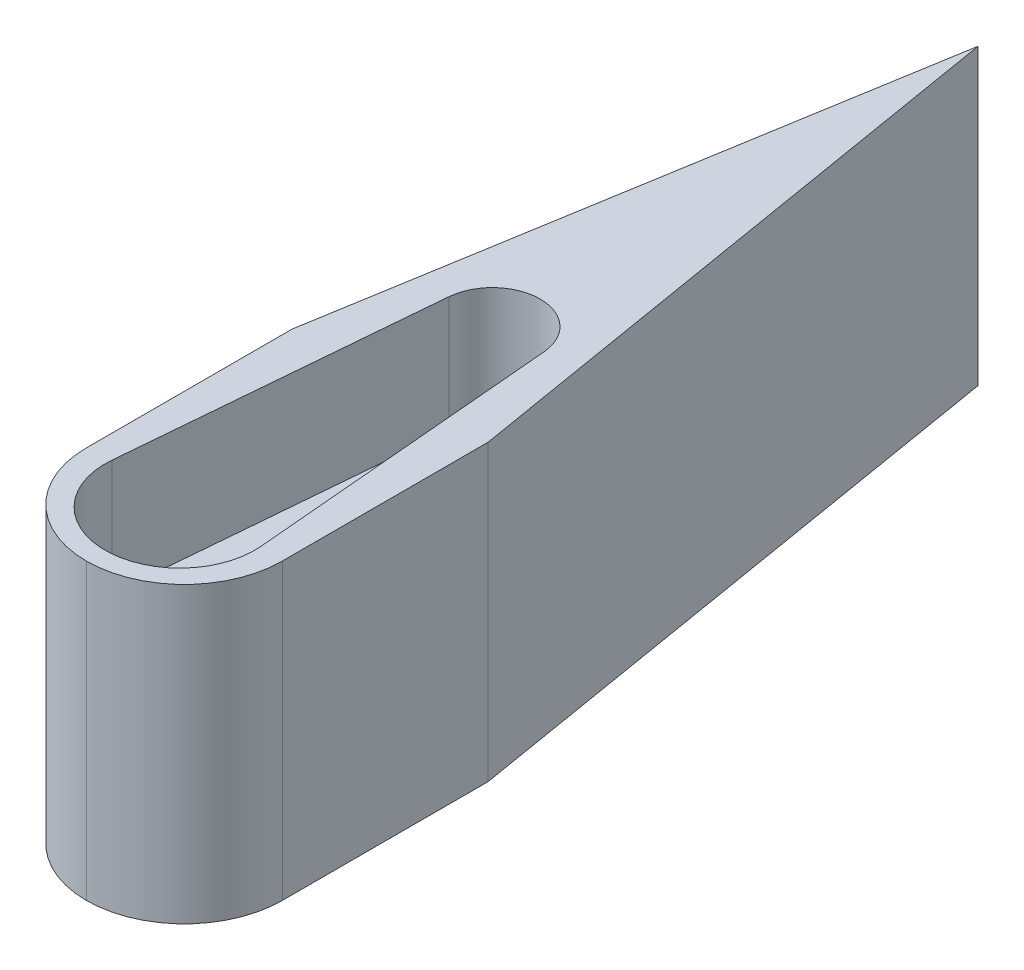
ISO-10303-21;
HEADER;
FILE_DESCRIPTION(('STEP AP214'),'2;1');
FILE_NAME('part.step','',(''),(''),'','','');
FILE_SCHEMA(('AUTOMOTIVE_DESIGN { 1 0 10303 214 1 1 1 1 }'));
ENDSEC;
DATA;
#1=APPLICATION_CONTEXT('core data for automotive mechanical design processes');
#2=APPLICATION_PROTOCOL_DEFINITION('international standard','automotive_design',2000,#1);
#3=PRODUCT_CONTEXT('',#1,'mechanical');
#4=PRODUCT('Part','Part','',(#3));
#5=PRODUCT_RELATED_PRODUCT_CATEGORY('part','',(#4));
#6=PRODUCT_DEFINITION_FORMATION('','',#4);
#7=PRODUCT_DEFINITION_CONTEXT('part definition',#1,'design');
#8=PRODUCT_DEFINITION('design','',#6,#7);
#9=PRODUCT_DEFINITION_SHAPE('','',#8);
#10=(LENGTH_UNIT() NAMED_UNIT(*) SI_UNIT(.MILLI.,.METRE.));
#11=(NAMED_UNIT(*) PLANE_ANGLE_UNIT() SI_UNIT($,.RADIAN.));
#12=(NAMED_UNIT(*) SI_UNIT($,.STERADIAN.) SOLID_ANGLE_UNIT());
#13=UNCERTAINTY_MEASURE_WITH_UNIT(LENGTH_MEASURE(1.E-05),#10,'distance_accuracy_value','');
#14=(GEOMETRIC_REPRESENTATION_CONTEXT(3) GLOBAL_UNCERTAINTY_ASSIGNED_CONTEXT((#13)) GLOBAL_UNIT_ASSIGNED_CONTEXT((#10,
#11,#12)) REPRESENTATION_CONTEXT('',''));
#15=CARTESIAN_POINT('',(0.,0.,0.));
#16=DIRECTION('',(0.,0.,1.));
#17=DIRECTION('',(1.,0.,0.));
#18=AXIS2_PLACEMENT_3D('',#15,#16,#17);
#19=CARTESIAN_POINT('',(0.,19.05,0.));
#20=DIRECTION('',(0.,1.,0.));
#21=DIRECTION('',(0.,0.,1.));
#22=AXIS2_PLACEMENT_3D('',#19,#20,#21);
#23=PLANE('',#22);
#24=DIRECTION('',(0.,0.,1.));
#25=VECTOR('',#24,1.);
#26=CARTESIAN_POINT('',(-6.35,19.05,0.));
#27=LINE('',#26,#25);
#28=CARTESIAN_POINT('',(-6.35,19.05,0.));
#29=VERTEX_POINT('',#28);
#30=CARTESIAN_POINT('',(-6.35,19.05,13.335));
#31=VERTEX_POINT('',#30);
#32=EDGE_CURVE('E150',#29,#31,#27,.T.);
#33=ORIENTED_EDGE('',*,*,#32,.T.);
#34=CARTESIAN_POINT('',(0.,19.05,13.335));
#35=DIRECTION('',(0.,1.,0.));
#36=DIRECTION('',(0.,0.,1.));
#37=AXIS2_PLACEMENT_3D('',#34,#35,#36);
#38=CIRCLE('',#37,6.35);
#39=CARTESIAN_POINT('',(0.,19.05,19.685));
#40=VERTEX_POINT('',#39);
#41=EDGE_CURVE('E48',#31,#40,#38,.T.);
#42=ORIENTED_EDGE('',*,*,#41,.T.);
#43=CARTESIAN_POINT('',(0.,19.05,13.335));
#44=DIRECTION('',(0.,1.,0.));
#45=DIRECTION('',(0.,0.,1.));
#46=AXIS2_PLACEMENT_3D('',#43,#44,#45);
#47=CIRCLE('',#46,6.35);
#48=CARTESIAN_POINT('',(6.35,19.05,13.335));
#49=VERTEX_POINT('',#48);
#50=EDGE_CURVE('E63',#40,#49,#47,.T.);
#51=ORIENTED_EDGE('',*,*,#50,.T.);
#52=DIRECTION('',(0.,0.,-1.));
#53=VECTOR('',#52,1.);
#54=CARTESIAN_POINT('',(6.35,19.05,0.));
#55=LINE('',#54,#53);
#56=CARTESIAN_POINT('',(6.35,19.05,0.));
#57=VERTEX_POINT('',#56);
#58=EDGE_CURVE('E153',#49,#57,#55,.T.);
#59=ORIENTED_EDGE('',*,*,#58,.T.);
#60=DIRECTION('',(-0.164398987305357,0.,-0.986393923832144));
#61=VECTOR('',#60,1.);
#62=CARTESIAN_POINT('',(0.,19.05,-38.1));
#63=LINE('',#62,#61);
#64=CARTESIAN_POINT('',(0.,19.05,-38.1));
#65=VERTEX_POINT('',#64);
#66=EDGE_CURVE('E144',#57,#65,#63,.T.);
#67=ORIENTED_EDGE('',*,*,#66,.T.);
#68=DIRECTION('',(-0.164398987305357,0.,0.986393923832144));
#69=VECTOR('',#68,1.);
#70=CARTESIAN_POINT('',(0.,19.05,-38.1));
#71=LINE('',#70,#69);
#72=EDGE_CURVE('E147',#65,#29,#71,.T.);
#73=ORIENTED_EDGE('',*,*,#72,.T.);
#74=EDGE_LOOP('',(#33,#42,#51,#59,#67,#73));
#75=FACE_BOUND('',#74,.T.);
#76=DIRECTION('',(0.08641975308642,0.,0.996258814905285));
#77=VECTOR('',#76,1.);
#78=CARTESIAN_POINT('',(3.08840232620704,19.05,-6.89625090927795));
#79=LINE('',#78,#77);
#80=CARTESIAN_POINT('',(3.08840232620704,19.05,-6.89625090927795));
#81=VERTEX_POINT('',#80);
#82=CARTESIAN_POINT('',(4.8318552522913,19.05,13.2025145228208));
#83=VERTEX_POINT('',#82);
#84=EDGE_CURVE('E131',#81,#83,#79,.T.);
#85=ORIENTED_EDGE('',*,*,#84,.T.);
#86=CARTESIAN_POINT('',(6.66567495644088E-13,19.05,13.62165032529));
#87=DIRECTION('',(0.,-1.,0.));
#88=DIRECTION('',(0.,0.,-1.));
#89=AXIS2_PLACEMENT_3D('',#86,#87,#88);
#90=CIRCLE('',#89,4.85);
#91=CARTESIAN_POINT('',(-4.83185525228996,19.05,13.2025145228208));
#92=VERTEX_POINT('',#91);
#93=EDGE_CURVE('E55',#83,#92,#90,.T.);
#94=ORIENTED_EDGE('',*,*,#93,.T.);
#95=DIRECTION('',(0.0864197530864198,0.,-0.996258814905285));
#96=VECTOR('',#95,1.);
#97=CARTESIAN_POINT('',(-4.83185525228996,19.05,13.2025145228208));
#98=LINE('',#97,#96);
#99=CARTESIAN_POINT('',(-3.08840232620572,19.05,-6.89625090927795));
#100=VERTEX_POINT('',#99);
#101=EDGE_CURVE('E135',#92,#100,#98,.T.);
#102=ORIENTED_EDGE('',*,*,#101,.T.);
#103=CARTESIAN_POINT('',(6.6418225086462E-13,19.05,-6.62834967471006));
#104=DIRECTION('',(0.,-1.,0.));
#105=DIRECTION('',(0.,0.,-1.));
#106=AXIS2_PLACEMENT_3D('',#103,#104,#105);
#107=CIRCLE('',#106,3.1);
#108=EDGE_CURVE('E317',#100,#81,#107,.T.);
#109=ORIENTED_EDGE('',*,*,#108,.T.);
#110=EDGE_LOOP('',(#85,#94,#102,#109));
#111=FACE_BOUND('',#110,.T.);
#112=ADVANCED_FACE('F39',(#75,#111),#23,.T.);
#113=CARTESIAN_POINT('',(0.,19.05,-38.1));
#114=DIRECTION('',(-0.986393923832144,0.,0.164398987305357));
#115=DIRECTION('',(0.164398987305357,0.,0.986393923832144));
#116=AXIS2_PLACEMENT_3D('',#113,#114,#115);
#117=PLANE('',#116);
#118=DIRECTION('',(-0.164398987305357,0.,-0.986393923832144));
#119=VECTOR('',#118,1.);
#120=CARTESIAN_POINT('',(0.,0.,-38.1));
#121=LINE('',#120,#119);
#122=CARTESIAN_POINT('',(6.35,0.,0.));
#123=VERTEX_POINT('',#122);
#124=CARTESIAN_POINT('',(0.,0.,-38.1));
#125=VERTEX_POINT('',#124);
#126=EDGE_CURVE('E139',#123,#125,#121,.T.);
#127=ORIENTED_EDGE('',*,*,#126,.T.);
#128=DIRECTION('',(0.,-1.,0.));
#129=VECTOR('',#128,1.);
#130=CARTESIAN_POINT('',(0.,19.05,-38.1));
#131=LINE('',#130,#129);
#132=EDGE_CURVE('E169',#65,#125,#131,.T.);
#133=ORIENTED_EDGE('',*,*,#132,.F.);
#134=ORIENTED_EDGE('',*,*,#66,.F.);
#135=DIRECTION('',(0.,-1.,0.));
#136=VECTOR('',#135,1.);
#137=CARTESIAN_POINT('',(6.35,19.05,0.));
#138=LINE('',#137,#136);
#139=EDGE_CURVE('E155',#57,#123,#138,.T.);
#140=ORIENTED_EDGE('',*,*,#139,.T.);
#141=EDGE_LOOP('',(#127,#133,#134,#140));
#142=FACE_BOUND('',#141,.T.);
#143=ADVANCED_FACE('F202',(#142),#117,.F.);
#144=CARTESIAN_POINT('',(0.,19.05,-38.1));
#145=DIRECTION('',(0.986393923832144,0.,0.164398987305357));
#146=DIRECTION('',(0.164398987305357,0.,-0.986393923832144));
#147=AXIS2_PLACEMENT_3D('',#144,#145,#146);
#148=PLANE('',#147);
#149=DIRECTION('',(-0.164398987305357,0.,0.986393923832144));
#150=VECTOR('',#149,1.);
#151=CARTESIAN_POINT('',(0.,0.,-38.1));
#152=LINE('',#151,#150);
#153=CARTESIAN_POINT('',(-6.35,0.,0.));
#154=VERTEX_POINT('',#153);
#155=EDGE_CURVE('E158',#125,#154,#152,.T.);
#156=ORIENTED_EDGE('',*,*,#155,.T.);
#157=DIRECTION('',(0.,-1.,0.));
#158=VECTOR('',#157,1.);
#159=CARTESIAN_POINT('',(-6.35,19.05,0.));
#160=LINE('',#159,#158);
#161=EDGE_CURVE('E166',#29,#154,#160,.T.);
#162=ORIENTED_EDGE('',*,*,#161,.F.);
#163=ORIENTED_EDGE('',*,*,#72,.F.);
#164=ORIENTED_EDGE('',*,*,#132,.T.);
#165=EDGE_LOOP('',(#156,#162,#163,#164));
#166=FACE_BOUND('',#165,.T.);
#167=ADVANCED_FACE('F198',(#166),#148,.F.);
#168=CARTESIAN_POINT('',(-6.35,19.05,0.));
#169=DIRECTION('',(1.,0.,0.));
#170=DIRECTION('',(0.,0.,-1.));
#171=AXIS2_PLACEMENT_3D('',#168,#169,#170);
#172=PLANE('',#171);
#173=DIRECTION('',(0.,0.,1.));
#174=VECTOR('',#173,1.);
#175=CARTESIAN_POINT('',(-6.35,0.,0.));
#176=LINE('',#175,#174);
#177=CARTESIAN_POINT('',(-6.35,0.,13.335));
#178=VERTEX_POINT('',#177);
#179=EDGE_CURVE('E160',#154,#178,#176,.T.);
#180=ORIENTED_EDGE('',*,*,#179,.T.);
#181=DIRECTION('',(0.,-1.,0.));
#182=VECTOR('',#181,1.);
#183=CARTESIAN_POINT('',(-6.35,19.05,13.335));
#184=LINE('',#183,#182);
#185=EDGE_CURVE('E176',#178,#31,#184,.F.);
#186=ORIENTED_EDGE('',*,*,#185,.T.);
#187=ORIENTED_EDGE('',*,*,#32,.F.);
#188=ORIENTED_EDGE('',*,*,#161,.T.);
#189=EDGE_LOOP('',(#180,#186,#187,#188));
#190=FACE_BOUND('',#189,.T.);
#191=ADVANCED_FACE('F195',(#190),#172,.F.);
#192=CARTESIAN_POINT('',(6.35,19.05,0.));
#193=DIRECTION('',(-1.,0.,0.));
#194=DIRECTION('',(0.,0.,1.));
#195=AXIS2_PLACEMENT_3D('',#192,#193,#194);
#196=PLANE('',#195);
#197=ORIENTED_EDGE('',*,*,#58,.F.);
#198=DIRECTION('',(0.,-1.,0.));
#199=VECTOR('',#198,1.);
#200=CARTESIAN_POINT('',(6.35,19.05,13.335));
#201=LINE('',#200,#199);
#202=CARTESIAN_POINT('',(6.35,0.,13.335));
#203=VERTEX_POINT('',#202);
#204=EDGE_CURVE('E11',#49,#203,#201,.T.);
#205=ORIENTED_EDGE('',*,*,#204,.T.);
#206=DIRECTION('',(0.,0.,-1.));
#207=VECTOR('',#206,1.);
#208=CARTESIAN_POINT('',(6.35,0.,0.));
#209=LINE('',#208,#207);
#210=EDGE_CURVE('E148',#203,#123,#209,.T.);
#211=ORIENTED_EDGE('',*,*,#210,.T.);
#212=ORIENTED_EDGE('',*,*,#139,.F.);
#213=EDGE_LOOP('',(#197,#205,#211,#212));
#214=FACE_BOUND('',#213,.T.);
#215=ADVANCED_FACE('F206',(#214),#196,.F.);
#216=CARTESIAN_POINT('',(0.,0.,0.));
#217=DIRECTION('',(0.,1.,0.));
#218=DIRECTION('',(0.,0.,1.));
#219=AXIS2_PLACEMENT_3D('',#216,#217,#218);
#220=PLANE('',#219);
#221=CARTESIAN_POINT('',(0.,0.,13.335));
#222=DIRECTION('',(0.,1.,0.));
#223=DIRECTION('',(0.,0.,1.));
#224=AXIS2_PLACEMENT_3D('',#221,#222,#223);
#225=CIRCLE('',#224,6.35);
#226=CARTESIAN_POINT('',(0.,0.,19.685));
#227=VERTEX_POINT('',#226);
#228=EDGE_CURVE('E172',#203,#227,#225,.F.);
#229=ORIENTED_EDGE('',*,*,#228,.T.);
#230=CARTESIAN_POINT('',(0.,0.,13.335));
#231=DIRECTION('',(0.,1.,0.));
#232=DIRECTION('',(0.,0.,1.));
#233=AXIS2_PLACEMENT_3D('',#230,#231,#232);
#234=CIRCLE('',#233,6.35);
#235=EDGE_CURVE('E174',#227,#178,#234,.F.);
#236=ORIENTED_EDGE('',*,*,#235,.T.);
#237=ORIENTED_EDGE('',*,*,#179,.F.);
#238=ORIENTED_EDGE('',*,*,#155,.F.);
#239=ORIENTED_EDGE('',*,*,#126,.F.);
#240=ORIENTED_EDGE('',*,*,#210,.F.);
#241=EDGE_LOOP('',(#229,#236,#237,#238,#239,#240));
#242=FACE_BOUND('',#241,.T.);
#243=ADVANCED_FACE('F192',(#242),#220,.F.);
#244=CARTESIAN_POINT('',(0.,19.05,13.335));
#245=DIRECTION('',(0.,-1.,0.));
#246=DIRECTION('',(0.,0.,-1.));
#247=AXIS2_PLACEMENT_3D('',#244,#245,#246);
#248=CYLINDRICAL_SURFACE('',#247,6.35);
#249=ORIENTED_EDGE('',*,*,#204,.F.);
#250=ORIENTED_EDGE('',*,*,#50,.F.);
#251=DIRECTION('',(0.,-1.,0.));
#252=VECTOR('',#251,1.);
#253=CARTESIAN_POINT('',(0.,19.05,19.685));
#254=LINE('',#253,#252);
#255=EDGE_CURVE('E43',#227,#40,#254,.F.);
#256=ORIENTED_EDGE('',*,*,#255,.F.);
#257=ORIENTED_EDGE('',*,*,#228,.F.);
#258=EDGE_LOOP('',(#249,#250,#256,#257));
#259=FACE_BOUND('',#258,.T.);
#260=ADVANCED_FACE('F41',(#259),#248,.T.);
#261=CARTESIAN_POINT('',(0.,19.05,13.335));
#262=DIRECTION('',(0.,-1.,0.));
#263=DIRECTION('',(0.,0.,-1.));
#264=AXIS2_PLACEMENT_3D('',#261,#262,#263);
#265=CYLINDRICAL_SURFACE('',#264,6.35);
#266=ORIENTED_EDGE('',*,*,#41,.F.);
#267=ORIENTED_EDGE('',*,*,#185,.F.);
#268=ORIENTED_EDGE('',*,*,#235,.F.);
#269=ORIENTED_EDGE('',*,*,#255,.T.);
#270=EDGE_LOOP('',(#266,#267,#268,#269));
#271=FACE_BOUND('',#270,.T.);
#272=ADVANCED_FACE('F189',(#271),#265,.T.);
#273=CARTESIAN_POINT('',(6.66567495644088E-13,11.55,13.62165032529));
#274=DIRECTION('',(0.,1.,0.));
#275=DIRECTION('',(0.,0.,1.));
#276=AXIS2_PLACEMENT_3D('',#273,#274,#275);
#277=CYLINDRICAL_SURFACE('',#276,4.85);
#278=ORIENTED_EDGE('',*,*,#93,.F.);
#279=DIRECTION('',(0.,1.,0.));
#280=VECTOR('',#279,1.);
#281=CARTESIAN_POINT('',(4.8318552522913,11.55,13.2025145228208));
#282=LINE('',#281,#280);
#283=CARTESIAN_POINT('',(4.8318552522913,11.55,13.2025145228208));
#284=VERTEX_POINT('',#283);
#285=EDGE_CURVE('E130',#284,#83,#282,.T.);
#286=ORIENTED_EDGE('',*,*,#285,.F.);
#287=CARTESIAN_POINT('',(6.66567495644088E-13,11.55,13.62165032529));
#288=DIRECTION('',(0.,-1.,0.));
#289=DIRECTION('',(0.,0.,-1.));
#290=AXIS2_PLACEMENT_3D('',#287,#288,#289);
#291=CIRCLE('',#290,4.85);
#292=CARTESIAN_POINT('',(-4.83185525228996,11.55,13.2025145228208));
#293=VERTEX_POINT('',#292);
#294=EDGE_CURVE('E122',#284,#293,#291,.T.);
#295=ORIENTED_EDGE('',*,*,#294,.T.);
#296=DIRECTION('',(0.,1.,0.));
#297=VECTOR('',#296,1.);
#298=CARTESIAN_POINT('',(-4.83185525228996,11.55,13.2025145228208));
#299=LINE('',#298,#297);
#300=EDGE_CURVE('E129',#293,#92,#299,.T.);
#301=ORIENTED_EDGE('',*,*,#300,.T.);
#302=EDGE_LOOP('',(#278,#286,#295,#301));
#303=FACE_BOUND('',#302,.T.);
#304=ADVANCED_FACE('F128',(#303),#277,.F.);
#305=CARTESIAN_POINT('',(-4.83185525228996,11.55,13.2025145228208));
#306=DIRECTION('',(0.996258814905285,0.,0.0864197530864198));
#307=DIRECTION('',(0.0864197530864198,0.,-0.996258814905285));
#308=AXIS2_PLACEMENT_3D('',#305,#306,#307);
#309=PLANE('',#308);
#310=ORIENTED_EDGE('',*,*,#101,.F.);
#311=ORIENTED_EDGE('',*,*,#300,.F.);
#312=DIRECTION('',(0.0864197530864198,0.,-0.996258814905285));
#313=VECTOR('',#312,1.);
#314=CARTESIAN_POINT('',(-4.83185525228996,11.55,13.2025145228208));
#315=LINE('',#314,#313);
#316=CARTESIAN_POINT('',(-3.08840232620572,11.55,-6.89625090927795));
#317=VERTEX_POINT('',#316);
#318=EDGE_CURVE('E118',#293,#317,#315,.T.);
#319=ORIENTED_EDGE('',*,*,#318,.T.);
#320=DIRECTION('',(0.,1.,0.));
#321=VECTOR('',#320,1.);
#322=CARTESIAN_POINT('',(-3.08840232620572,11.55,-6.89625090927795));
#323=LINE('',#322,#321);
#324=EDGE_CURVE('E136',#317,#100,#323,.T.);
#325=ORIENTED_EDGE('',*,*,#324,.T.);
#326=EDGE_LOOP('',(#310,#311,#319,#325));
#327=FACE_BOUND('',#326,.T.);
#328=ADVANCED_FACE('F133',(#327),#309,.T.);
#329=CARTESIAN_POINT('',(6.6418225086462E-13,11.55,-6.62834967471006));
#330=DIRECTION('',(0.,1.,0.));
#331=DIRECTION('',(0.,0.,1.));
#332=AXIS2_PLACEMENT_3D('',#329,#330,#331);
#333=CYLINDRICAL_SURFACE('',#332,3.1);
#334=ORIENTED_EDGE('',*,*,#108,.F.);
#335=ORIENTED_EDGE('',*,*,#324,.F.);
#336=CARTESIAN_POINT('',(6.6418225086462E-13,11.55,-6.62834967471006));
#337=DIRECTION('',(0.,-1.,0.));
#338=DIRECTION('',(0.,0.,-1.));
#339=AXIS2_PLACEMENT_3D('',#336,#337,#338);
#340=CIRCLE('',#339,3.1);
#341=CARTESIAN_POINT('',(3.08840232620704,11.55,-6.89625090927795));
#342=VERTEX_POINT('',#341);
#343=EDGE_CURVE('E123',#317,#342,#340,.T.);
#344=ORIENTED_EDGE('',*,*,#343,.T.);
#345=DIRECTION('',(0.,1.,0.));
#346=VECTOR('',#345,1.);
#347=CARTESIAN_POINT('',(3.08840232620704,11.55,-6.89625090927795));
#348=LINE('',#347,#346);
#349=EDGE_CURVE('E140',#342,#81,#348,.T.);
#350=ORIENTED_EDGE('',*,*,#349,.T.);
#351=EDGE_LOOP('',(#334,#335,#344,#350));
#352=FACE_BOUND('',#351,.T.);
#353=ADVANCED_FACE('F227',(#352),#333,.F.);
#354=CARTESIAN_POINT('',(3.08840232620704,11.55,-6.89625090927795));
#355=DIRECTION('',(-0.996258814905285,0.,0.0864197530864199));
#356=DIRECTION('',(0.0864197530864199,0.,0.996258814905285));
#357=AXIS2_PLACEMENT_3D('',#354,#355,#356);
#358=PLANE('',#357);
#359=ORIENTED_EDGE('',*,*,#84,.F.);
#360=ORIENTED_EDGE('',*,*,#349,.F.);
#361=DIRECTION('',(0.08641975308642,0.,0.996258814905285));
#362=VECTOR('',#361,1.);
#363=CARTESIAN_POINT('',(3.08840232620704,11.55,-6.89625090927795));
#364=LINE('',#363,#362);
#365=EDGE_CURVE('E324',#342,#284,#364,.T.);
#366=ORIENTED_EDGE('',*,*,#365,.T.);
#367=ORIENTED_EDGE('',*,*,#285,.T.);
#368=EDGE_LOOP('',(#359,#360,#366,#367));
#369=FACE_BOUND('',#368,.T.);
#370=ADVANCED_FACE('F230',(#369),#358,.T.);
#371=CARTESIAN_POINT('',(6.66567495644088E-13,11.55,13.62165032529));
#372=DIRECTION('',(0.,-1.,0.));
#373=DIRECTION('',(0.,0.,-1.));
#374=AXIS2_PLACEMENT_3D('',#371,#372,#373);
#375=PLANE('',#374);
#376=ORIENTED_EDGE('',*,*,#294,.F.);
#377=ORIENTED_EDGE('',*,*,#365,.F.);
#378=ORIENTED_EDGE('',*,*,#343,.F.);
#379=ORIENTED_EDGE('',*,*,#318,.F.);
#380=EDGE_LOOP('',(#376,#377,#378,#379));
#381=FACE_BOUND('',#380,.T.);
#382=ADVANCED_FACE('F120',(#381),#375,.F.);
#383=CLOSED_SHELL('',(#112,#143,#167,#191,#215,#243,#260,#272,#304,#328,#353,#370,#382));
#384=MANIFOLD_SOLID_BREP('B2',#383);
#385=ADVANCED_BREP_SHAPE_REPRESENTATION('',(#18,#384),#14);
#386=SHAPE_DEFINITION_REPRESENTATION(#9,#385);
ENDSEC;
END-ISO-10303-21;
